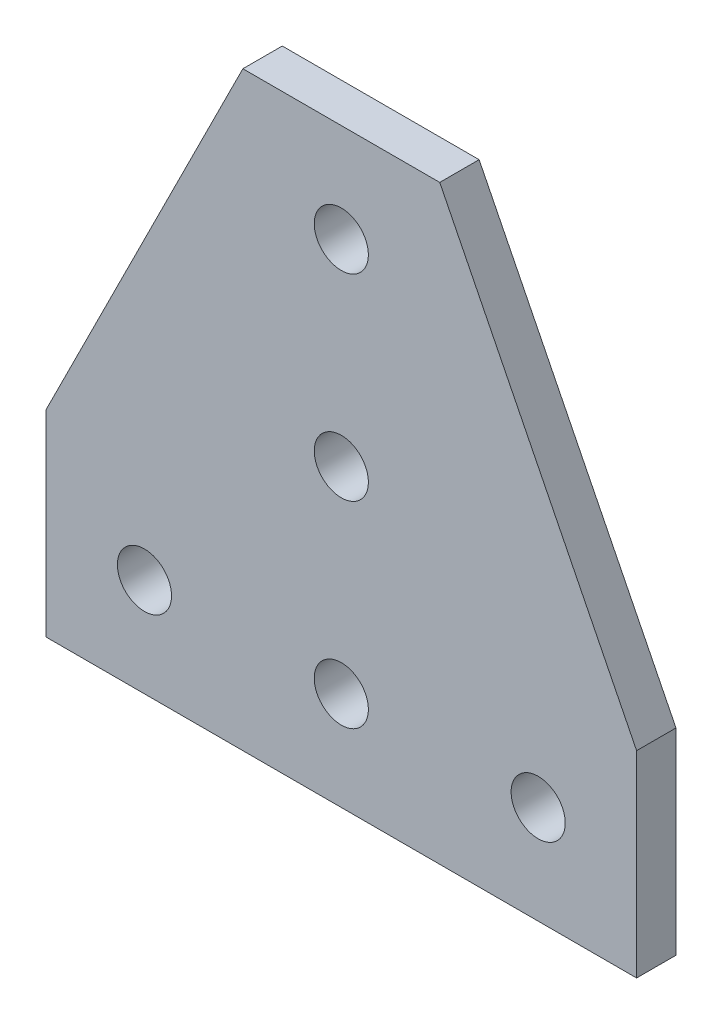
ISO-10303-21;
HEADER;
FILE_DESCRIPTION(('STEP AP214'),'2;1');
FILE_NAME('part.step','',(''),(''),'','','');
FILE_SCHEMA(('AUTOMOTIVE_DESIGN { 1 0 10303 214 1 1 1 1 }'));
ENDSEC;
DATA;
#1=APPLICATION_CONTEXT('core data for automotive mechanical design processes');
#2=APPLICATION_PROTOCOL_DEFINITION('international standard','automotive_design',2000,#1);
#3=PRODUCT_CONTEXT('',#1,'mechanical');
#4=PRODUCT('Part','Part','',(#3));
#5=PRODUCT_RELATED_PRODUCT_CATEGORY('part','',(#4));
#6=PRODUCT_DEFINITION_FORMATION('','',#4);
#7=PRODUCT_DEFINITION_CONTEXT('part definition',#1,'design');
#8=PRODUCT_DEFINITION('design','',#6,#7);
#9=PRODUCT_DEFINITION_SHAPE('','',#8);
#10=(LENGTH_UNIT() NAMED_UNIT(*) SI_UNIT(.MILLI.,.METRE.));
#11=(NAMED_UNIT(*) PLANE_ANGLE_UNIT() SI_UNIT($,.RADIAN.));
#12=(NAMED_UNIT(*) SI_UNIT($,.STERADIAN.) SOLID_ANGLE_UNIT());
#13=UNCERTAINTY_MEASURE_WITH_UNIT(LENGTH_MEASURE(1.E-05),#10,'distance_accuracy_value','');
#14=(GEOMETRIC_REPRESENTATION_CONTEXT(3) GLOBAL_UNCERTAINTY_ASSIGNED_CONTEXT((#13)) GLOBAL_UNIT_ASSIGNED_CONTEXT((#10,
#11,#12)) REPRESENTATION_CONTEXT('',''));
#15=CARTESIAN_POINT('',(0.,0.,0.));
#16=DIRECTION('',(0.,0.,1.));
#17=DIRECTION('',(1.,0.,0.));
#18=AXIS2_PLACEMENT_3D('',#15,#16,#17);
#19=CARTESIAN_POINT('',(0.,0.,2.));
#20=DIRECTION('',(0.,0.,-1.));
#21=DIRECTION('',(-1.,0.,0.));
#22=AXIS2_PLACEMENT_3D('',#19,#20,#21);
#23=PLANE('',#22);
#24=DIRECTION('',(1.,0.,0.));
#25=VECTOR('',#24,1.);
#26=CARTESIAN_POINT('',(60.,0.,2.));
#27=LINE('',#26,#25);
#28=CARTESIAN_POINT('',(0.,0.,2.));
#29=VERTEX_POINT('',#28);
#30=CARTESIAN_POINT('',(60.,0.,2.));
#31=VERTEX_POINT('',#30);
#32=EDGE_CURVE('E150',#29,#31,#27,.T.);
#33=ORIENTED_EDGE('',*,*,#32,.T.);
#34=DIRECTION('',(0.,1.,0.));
#35=VECTOR('',#34,1.);
#36=CARTESIAN_POINT('',(60.,20.,2.));
#37=LINE('',#36,#35);
#38=CARTESIAN_POINT('',(60.,20.,2.));
#39=VERTEX_POINT('',#38);
#40=EDGE_CURVE('E98',#31,#39,#37,.T.);
#41=ORIENTED_EDGE('',*,*,#40,.T.);
#42=DIRECTION('',(-0.447213595499958,0.894427190999916,0.));
#43=VECTOR('',#42,1.);
#44=CARTESIAN_POINT('',(40.,60.,2.));
#45=LINE('',#44,#43);
#46=CARTESIAN_POINT('',(40.,60.,2.));
#47=VERTEX_POINT('',#46);
#48=EDGE_CURVE('E111',#39,#47,#45,.T.);
#49=ORIENTED_EDGE('',*,*,#48,.T.);
#50=DIRECTION('',(-1.,0.,0.));
#51=VECTOR('',#50,1.);
#52=CARTESIAN_POINT('',(40.,60.,2.));
#53=LINE('',#52,#51);
#54=CARTESIAN_POINT('',(20.,60.,2.));
#55=VERTEX_POINT('',#54);
#56=EDGE_CURVE('E105',#47,#55,#53,.T.);
#57=ORIENTED_EDGE('',*,*,#56,.T.);
#58=DIRECTION('',(-0.447213595499958,-0.894427190999916,0.));
#59=VECTOR('',#58,1.);
#60=CARTESIAN_POINT('',(0.,20.,2.));
#61=LINE('',#60,#59);
#62=CARTESIAN_POINT('',(0.,20.,2.));
#63=VERTEX_POINT('',#62);
#64=EDGE_CURVE('E109',#55,#63,#61,.T.);
#65=ORIENTED_EDGE('',*,*,#64,.T.);
#66=DIRECTION('',(0.,-1.,0.));
#67=VECTOR('',#66,1.);
#68=CARTESIAN_POINT('',(0.,0.,2.));
#69=LINE('',#68,#67);
#70=EDGE_CURVE('E61',#63,#29,#69,.T.);
#71=ORIENTED_EDGE('',*,*,#70,.T.);
#72=EDGE_LOOP('',(#33,#41,#49,#57,#65,#71));
#73=FACE_BOUND('',#72,.T.);
#74=CARTESIAN_POINT('',(10.,9.99999999999999,2.));
#75=DIRECTION('',(0.,0.,1.));
#76=DIRECTION('',(1.,0.,0.));
#77=AXIS2_PLACEMENT_3D('',#74,#75,#76);
#78=CIRCLE('',#77,2.75);
#79=CARTESIAN_POINT('',(12.75,9.99999999999999,2.));
#80=VERTEX_POINT('',#79);
#81=EDGE_CURVE('E138',#80,#80,#78,.T.);
#82=ORIENTED_EDGE('',*,*,#81,.F.);
#83=EDGE_LOOP('',(#82));
#84=FACE_BOUND('',#83,.T.);
#85=CARTESIAN_POINT('',(30.,9.99999999999999,2.));
#86=DIRECTION('',(0.,0.,1.));
#87=DIRECTION('',(1.,0.,0.));
#88=AXIS2_PLACEMENT_3D('',#85,#86,#87);
#89=CIRCLE('',#88,2.75);
#90=CARTESIAN_POINT('',(32.75,9.99999999999999,2.));
#91=VERTEX_POINT('',#90);
#92=EDGE_CURVE('E234',#91,#91,#89,.T.);
#93=ORIENTED_EDGE('',*,*,#92,.F.);
#94=EDGE_LOOP('',(#93));
#95=FACE_BOUND('',#94,.T.);
#96=CARTESIAN_POINT('',(50.,9.99999999999999,2.));
#97=DIRECTION('',(0.,0.,1.));
#98=DIRECTION('',(1.,0.,0.));
#99=AXIS2_PLACEMENT_3D('',#96,#97,#98);
#100=CIRCLE('',#99,2.75000000000001);
#101=CARTESIAN_POINT('',(52.75,9.99999999999999,2.));
#102=VERTEX_POINT('',#101);
#103=EDGE_CURVE('E226',#102,#102,#100,.T.);
#104=ORIENTED_EDGE('',*,*,#103,.F.);
#105=EDGE_LOOP('',(#104));
#106=FACE_BOUND('',#105,.T.);
#107=CARTESIAN_POINT('',(30.,30.,2.));
#108=DIRECTION('',(0.,0.,1.));
#109=DIRECTION('',(1.,0.,0.));
#110=AXIS2_PLACEMENT_3D('',#107,#108,#109);
#111=CIRCLE('',#110,2.75000000000001);
#112=CARTESIAN_POINT('',(32.75,30.,2.));
#113=VERTEX_POINT('',#112);
#114=EDGE_CURVE('E218',#113,#113,#111,.T.);
#115=ORIENTED_EDGE('',*,*,#114,.F.);
#116=EDGE_LOOP('',(#115));
#117=FACE_BOUND('',#116,.T.);
#118=CARTESIAN_POINT('',(30.,50.,2.));
#119=DIRECTION('',(0.,0.,1.));
#120=DIRECTION('',(1.,0.,0.));
#121=AXIS2_PLACEMENT_3D('',#118,#119,#120);
#122=CIRCLE('',#121,2.75);
#123=CARTESIAN_POINT('',(32.75,50.,2.));
#124=VERTEX_POINT('',#123);
#125=EDGE_CURVE('E207',#124,#124,#122,.T.);
#126=ORIENTED_EDGE('',*,*,#125,.F.);
#127=EDGE_LOOP('',(#126));
#128=FACE_BOUND('',#127,.T.);
#129=ADVANCED_FACE('F43',(#73,#84,#95,#106,#117,#128),#23,.F.);
#130=CARTESIAN_POINT('',(0.,0.,-2.));
#131=DIRECTION('',(0.,0.,-1.));
#132=DIRECTION('',(-1.,0.,0.));
#133=AXIS2_PLACEMENT_3D('',#130,#131,#132);
#134=PLANE('',#133);
#135=CARTESIAN_POINT('',(30.,30.,-2.));
#136=DIRECTION('',(0.,0.,1.));
#137=DIRECTION('',(1.,0.,0.));
#138=AXIS2_PLACEMENT_3D('',#135,#136,#137);
#139=CIRCLE('',#138,2.75000000000001);
#140=CARTESIAN_POINT('',(32.75,30.,-2.));
#141=VERTEX_POINT('',#140);
#142=EDGE_CURVE('E215',#141,#141,#139,.T.);
#143=ORIENTED_EDGE('',*,*,#142,.T.);
#144=EDGE_LOOP('',(#143));
#145=FACE_BOUND('',#144,.T.);
#146=CARTESIAN_POINT('',(30.,9.99999999999999,-2.));
#147=DIRECTION('',(0.,0.,1.));
#148=DIRECTION('',(1.,0.,0.));
#149=AXIS2_PLACEMENT_3D('',#146,#147,#148);
#150=CIRCLE('',#149,2.75);
#151=CARTESIAN_POINT('',(32.75,9.99999999999999,-2.));
#152=VERTEX_POINT('',#151);
#153=EDGE_CURVE('E230',#152,#152,#150,.T.);
#154=ORIENTED_EDGE('',*,*,#153,.T.);
#155=EDGE_LOOP('',(#154));
#156=FACE_BOUND('',#155,.T.);
#157=DIRECTION('',(1.,0.,0.));
#158=VECTOR('',#157,1.);
#159=CARTESIAN_POINT('',(60.,0.,-2.));
#160=LINE('',#159,#158);
#161=CARTESIAN_POINT('',(0.,0.,-2.));
#162=VERTEX_POINT('',#161);
#163=CARTESIAN_POINT('',(60.,0.,-2.));
#164=VERTEX_POINT('',#163);
#165=EDGE_CURVE('E133',#162,#164,#160,.T.);
#166=ORIENTED_EDGE('',*,*,#165,.F.);
#167=DIRECTION('',(0.,-1.,0.));
#168=VECTOR('',#167,1.);
#169=CARTESIAN_POINT('',(0.,0.,-2.));
#170=LINE('',#169,#168);
#171=CARTESIAN_POINT('',(0.,20.,-2.));
#172=VERTEX_POINT('',#171);
#173=EDGE_CURVE('E90',#172,#162,#170,.T.);
#174=ORIENTED_EDGE('',*,*,#173,.F.);
#175=DIRECTION('',(-0.447213595499958,-0.894427190999916,0.));
#176=VECTOR('',#175,1.);
#177=CARTESIAN_POINT('',(0.,20.,-2.));
#178=LINE('',#177,#176);
#179=CARTESIAN_POINT('',(20.,60.,-2.));
#180=VERTEX_POINT('',#179);
#181=EDGE_CURVE('E84',#180,#172,#178,.T.);
#182=ORIENTED_EDGE('',*,*,#181,.F.);
#183=DIRECTION('',(-1.,0.,0.));
#184=VECTOR('',#183,1.);
#185=CARTESIAN_POINT('',(40.,60.,-2.));
#186=LINE('',#185,#184);
#187=CARTESIAN_POINT('',(40.,60.,-2.));
#188=VERTEX_POINT('',#187);
#189=EDGE_CURVE('E120',#188,#180,#186,.T.);
#190=ORIENTED_EDGE('',*,*,#189,.F.);
#191=DIRECTION('',(-0.447213595499958,0.894427190999916,0.));
#192=VECTOR('',#191,1.);
#193=CARTESIAN_POINT('',(40.,60.,-2.));
#194=LINE('',#193,#192);
#195=CARTESIAN_POINT('',(60.,20.,-2.));
#196=VERTEX_POINT('',#195);
#197=EDGE_CURVE('E141',#196,#188,#194,.T.);
#198=ORIENTED_EDGE('',*,*,#197,.F.);
#199=DIRECTION('',(0.,1.,0.));
#200=VECTOR('',#199,1.);
#201=CARTESIAN_POINT('',(60.,20.,-2.));
#202=LINE('',#201,#200);
#203=EDGE_CURVE('E137',#164,#196,#202,.T.);
#204=ORIENTED_EDGE('',*,*,#203,.F.);
#205=EDGE_LOOP('',(#166,#174,#182,#190,#198,#204));
#206=FACE_BOUND('',#205,.T.);
#207=CARTESIAN_POINT('',(10.,9.99999999999999,-2.));
#208=DIRECTION('',(0.,0.,1.));
#209=DIRECTION('',(1.,0.,0.));
#210=AXIS2_PLACEMENT_3D('',#207,#208,#209);
#211=CIRCLE('',#210,2.75);
#212=CARTESIAN_POINT('',(12.75,9.99999999999999,-2.));
#213=VERTEX_POINT('',#212);
#214=EDGE_CURVE('E238',#213,#213,#211,.T.);
#215=ORIENTED_EDGE('',*,*,#214,.T.);
#216=EDGE_LOOP('',(#215));
#217=FACE_BOUND('',#216,.T.);
#218=CARTESIAN_POINT('',(50.,9.99999999999999,-2.));
#219=DIRECTION('',(0.,0.,1.));
#220=DIRECTION('',(1.,0.,0.));
#221=AXIS2_PLACEMENT_3D('',#218,#219,#220);
#222=CIRCLE('',#221,2.75000000000001);
#223=CARTESIAN_POINT('',(52.75,9.99999999999999,-2.));
#224=VERTEX_POINT('',#223);
#225=EDGE_CURVE('E222',#224,#224,#222,.T.);
#226=ORIENTED_EDGE('',*,*,#225,.T.);
#227=EDGE_LOOP('',(#226));
#228=FACE_BOUND('',#227,.T.);
#229=CARTESIAN_POINT('',(30.,50.,-2.));
#230=DIRECTION('',(0.,0.,1.));
#231=DIRECTION('',(1.,0.,0.));
#232=AXIS2_PLACEMENT_3D('',#229,#230,#231);
#233=CIRCLE('',#232,2.75);
#234=CARTESIAN_POINT('',(32.75,50.,-2.));
#235=VERTEX_POINT('',#234);
#236=EDGE_CURVE('E210',#235,#235,#233,.T.);
#237=ORIENTED_EDGE('',*,*,#236,.T.);
#238=EDGE_LOOP('',(#237));
#239=FACE_BOUND('',#238,.T.);
#240=ADVANCED_FACE('F163',(#145,#156,#206,#217,#228,#239),#134,.T.);
#241=CARTESIAN_POINT('',(60.,0.,2.));
#242=DIRECTION('',(0.,1.,0.));
#243=DIRECTION('',(-1.,0.,0.));
#244=AXIS2_PLACEMENT_3D('',#241,#242,#243);
#245=PLANE('',#244);
#246=ORIENTED_EDGE('',*,*,#165,.T.);
#247=DIRECTION('',(0.,0.,-1.));
#248=VECTOR('',#247,1.);
#249=CARTESIAN_POINT('',(60.,0.,2.));
#250=LINE('',#249,#248);
#251=EDGE_CURVE('E11',#31,#164,#250,.T.);
#252=ORIENTED_EDGE('',*,*,#251,.F.);
#253=ORIENTED_EDGE('',*,*,#32,.F.);
#254=DIRECTION('',(0.,0.,-1.));
#255=VECTOR('',#254,1.);
#256=CARTESIAN_POINT('',(0.,0.,2.));
#257=LINE('',#256,#255);
#258=EDGE_CURVE('E129',#29,#162,#257,.T.);
#259=ORIENTED_EDGE('',*,*,#258,.T.);
#260=EDGE_LOOP('',(#246,#252,#253,#259));
#261=FACE_BOUND('',#260,.T.);
#262=ADVANCED_FACE('F45',(#261),#245,.F.);
#263=CARTESIAN_POINT('',(60.,20.,2.));
#264=DIRECTION('',(-1.,0.,0.));
#265=DIRECTION('',(0.,0.,1.));
#266=AXIS2_PLACEMENT_3D('',#263,#264,#265);
#267=PLANE('',#266);
#268=ORIENTED_EDGE('',*,*,#203,.T.);
#269=DIRECTION('',(0.,0.,-1.));
#270=VECTOR('',#269,1.);
#271=CARTESIAN_POINT('',(60.,20.,2.));
#272=LINE('',#271,#270);
#273=EDGE_CURVE('E53',#39,#196,#272,.T.);
#274=ORIENTED_EDGE('',*,*,#273,.F.);
#275=ORIENTED_EDGE('',*,*,#40,.F.);
#276=ORIENTED_EDGE('',*,*,#251,.T.);
#277=EDGE_LOOP('',(#268,#274,#275,#276));
#278=FACE_BOUND('',#277,.T.);
#279=ADVANCED_FACE('F317',(#278),#267,.F.);
#280=CARTESIAN_POINT('',(40.,60.,2.));
#281=DIRECTION('',(-0.894427190999916,-0.447213595499958,0.));
#282=DIRECTION('',(0.447213595499958,-0.894427190999916,0.));
#283=AXIS2_PLACEMENT_3D('',#280,#281,#282);
#284=PLANE('',#283);
#285=ORIENTED_EDGE('',*,*,#197,.T.);
#286=DIRECTION('',(0.,0.,-1.));
#287=VECTOR('',#286,1.);
#288=CARTESIAN_POINT('',(40.,60.,2.));
#289=LINE('',#288,#287);
#290=EDGE_CURVE('E122',#47,#188,#289,.T.);
#291=ORIENTED_EDGE('',*,*,#290,.F.);
#292=ORIENTED_EDGE('',*,*,#48,.F.);
#293=ORIENTED_EDGE('',*,*,#273,.T.);
#294=EDGE_LOOP('',(#285,#291,#292,#293));
#295=FACE_BOUND('',#294,.T.);
#296=ADVANCED_FACE('F160',(#295),#284,.F.);
#297=CARTESIAN_POINT('',(40.,60.,2.));
#298=DIRECTION('',(0.,-1.,0.));
#299=DIRECTION('',(0.,0.,-1.));
#300=AXIS2_PLACEMENT_3D('',#297,#298,#299);
#301=PLANE('',#300);
#302=ORIENTED_EDGE('',*,*,#189,.T.);
#303=DIRECTION('',(0.,0.,-1.));
#304=VECTOR('',#303,1.);
#305=CARTESIAN_POINT('',(20.,60.,2.));
#306=LINE('',#305,#304);
#307=EDGE_CURVE('E117',#55,#180,#306,.T.);
#308=ORIENTED_EDGE('',*,*,#307,.F.);
#309=ORIENTED_EDGE('',*,*,#56,.F.);
#310=ORIENTED_EDGE('',*,*,#290,.T.);
#311=EDGE_LOOP('',(#302,#308,#309,#310));
#312=FACE_BOUND('',#311,.T.);
#313=ADVANCED_FACE('F118',(#312),#301,.F.);
#314=CARTESIAN_POINT('',(0.,20.,2.));
#315=DIRECTION('',(0.894427190999916,-0.447213595499958,0.));
#316=DIRECTION('',(0.447213595499958,0.894427190999916,0.));
#317=AXIS2_PLACEMENT_3D('',#314,#315,#316);
#318=PLANE('',#317);
#319=ORIENTED_EDGE('',*,*,#181,.T.);
#320=DIRECTION('',(0.,0.,-1.));
#321=VECTOR('',#320,1.);
#322=CARTESIAN_POINT('',(0.,20.,2.));
#323=LINE('',#322,#321);
#324=EDGE_CURVE('E123',#63,#172,#323,.T.);
#325=ORIENTED_EDGE('',*,*,#324,.F.);
#326=ORIENTED_EDGE('',*,*,#64,.F.);
#327=ORIENTED_EDGE('',*,*,#307,.T.);
#328=EDGE_LOOP('',(#319,#325,#326,#327));
#329=FACE_BOUND('',#328,.T.);
#330=ADVANCED_FACE('F125',(#329),#318,.F.);
#331=CARTESIAN_POINT('',(0.,0.,2.));
#332=DIRECTION('',(1.,0.,0.));
#333=DIRECTION('',(0.,1.,0.));
#334=AXIS2_PLACEMENT_3D('',#331,#332,#333);
#335=PLANE('',#334);
#336=ORIENTED_EDGE('',*,*,#173,.T.);
#337=ORIENTED_EDGE('',*,*,#258,.F.);
#338=ORIENTED_EDGE('',*,*,#70,.F.);
#339=ORIENTED_EDGE('',*,*,#324,.T.);
#340=EDGE_LOOP('',(#336,#337,#338,#339));
#341=FACE_BOUND('',#340,.T.);
#342=ADVANCED_FACE('F168',(#341),#335,.F.);
#343=CARTESIAN_POINT('',(10.,9.99999999999999,2.));
#344=DIRECTION('',(0.,0.,-1.));
#345=DIRECTION('',(-1.,0.,0.));
#346=AXIS2_PLACEMENT_3D('',#343,#344,#345);
#347=CYLINDRICAL_SURFACE('',#346,2.75);
#348=ORIENTED_EDGE('',*,*,#81,.T.);
#349=EDGE_LOOP('',(#348));
#350=FACE_BOUND('',#349,.T.);
#351=ORIENTED_EDGE('',*,*,#214,.F.);
#352=EDGE_LOOP('',(#351));
#353=FACE_BOUND('',#352,.T.);
#354=ADVANCED_FACE('F170',(#350,#353),#347,.F.);
#355=CARTESIAN_POINT('',(30.,9.99999999999999,2.));
#356=DIRECTION('',(0.,0.,-1.));
#357=DIRECTION('',(-1.,0.,0.));
#358=AXIS2_PLACEMENT_3D('',#355,#356,#357);
#359=CYLINDRICAL_SURFACE('',#358,2.75);
#360=ORIENTED_EDGE('',*,*,#92,.T.);
#361=EDGE_LOOP('',(#360));
#362=FACE_BOUND('',#361,.T.);
#363=ORIENTED_EDGE('',*,*,#153,.F.);
#364=EDGE_LOOP('',(#363));
#365=FACE_BOUND('',#364,.T.);
#366=ADVANCED_FACE('F176',(#362,#365),#359,.F.);
#367=CARTESIAN_POINT('',(50.,9.99999999999999,2.));
#368=DIRECTION('',(0.,0.,-1.));
#369=DIRECTION('',(-1.,0.,0.));
#370=AXIS2_PLACEMENT_3D('',#367,#368,#369);
#371=CYLINDRICAL_SURFACE('',#370,2.75000000000001);
#372=ORIENTED_EDGE('',*,*,#103,.T.);
#373=EDGE_LOOP('',(#372));
#374=FACE_BOUND('',#373,.T.);
#375=ORIENTED_EDGE('',*,*,#225,.F.);
#376=EDGE_LOOP('',(#375));
#377=FACE_BOUND('',#376,.T.);
#378=ADVANCED_FACE('F190',(#374,#377),#371,.F.);
#379=CARTESIAN_POINT('',(30.,30.,2.));
#380=DIRECTION('',(0.,0.,-1.));
#381=DIRECTION('',(-1.,0.,0.));
#382=AXIS2_PLACEMENT_3D('',#379,#380,#381);
#383=CYLINDRICAL_SURFACE('',#382,2.75000000000001);
#384=ORIENTED_EDGE('',*,*,#114,.T.);
#385=EDGE_LOOP('',(#384));
#386=FACE_BOUND('',#385,.T.);
#387=ORIENTED_EDGE('',*,*,#142,.F.);
#388=EDGE_LOOP('',(#387));
#389=FACE_BOUND('',#388,.T.);
#390=ADVANCED_FACE('F194',(#386,#389),#383,.F.);
#391=CARTESIAN_POINT('',(30.,50.,2.));
#392=DIRECTION('',(0.,0.,-1.));
#393=DIRECTION('',(-1.,0.,0.));
#394=AXIS2_PLACEMENT_3D('',#391,#392,#393);
#395=CYLINDRICAL_SURFACE('',#394,2.75);
#396=ORIENTED_EDGE('',*,*,#125,.T.);
#397=EDGE_LOOP('',(#396));
#398=FACE_BOUND('',#397,.T.);
#399=ORIENTED_EDGE('',*,*,#236,.F.);
#400=EDGE_LOOP('',(#399));
#401=FACE_BOUND('',#400,.T.);
#402=ADVANCED_FACE('F198',(#398,#401),#395,.F.);
#403=CLOSED_SHELL('',(#129,#240,#262,#279,#296,#313,#330,#342,#354,#366,#378,#390,#402));
#404=MANIFOLD_SOLID_BREP('B2',#403);
#405=ADVANCED_BREP_SHAPE_REPRESENTATION('',(#18,#404),#14);
#406=SHAPE_DEFINITION_REPRESENTATION(#9,#405);
ENDSEC;
END-ISO-10303-21;
